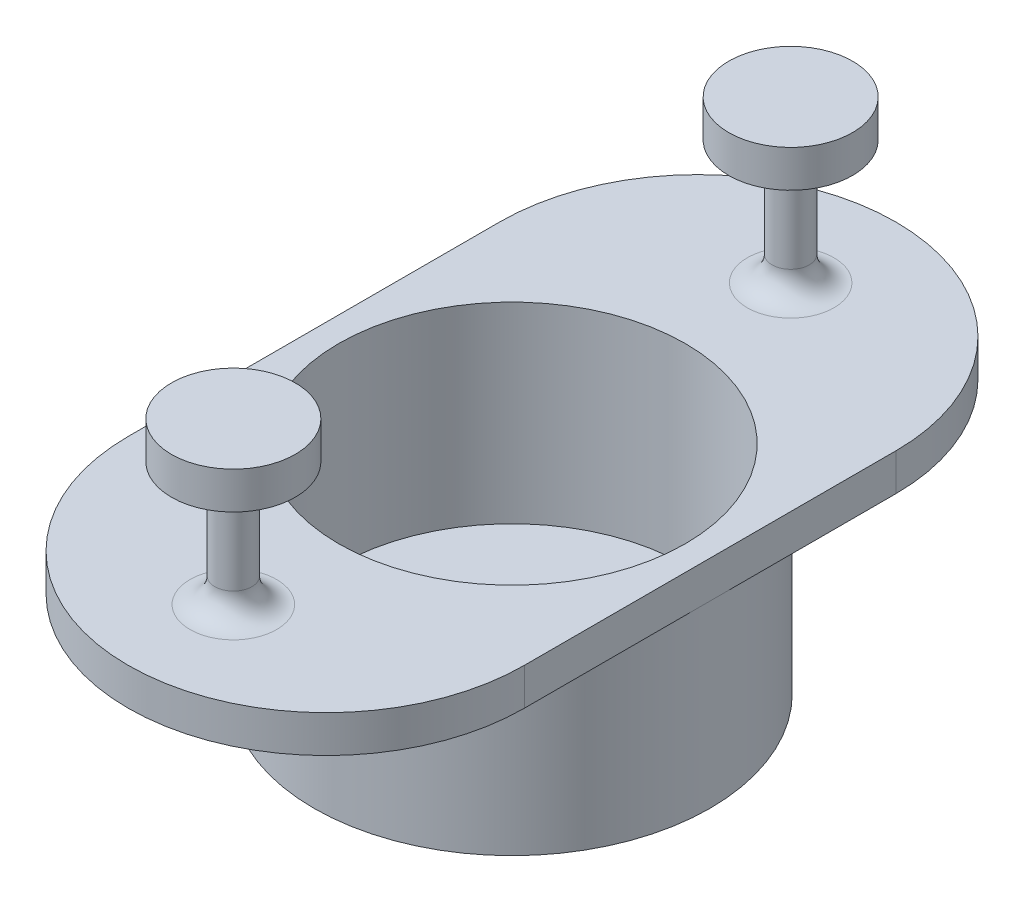
ISO-10303-21;
HEADER;
FILE_DESCRIPTION(('STEP AP214'),'2;1');
FILE_NAME('part.step','',(''),(''),'','','');
FILE_SCHEMA(('AUTOMOTIVE_DESIGN { 1 0 10303 214 1 1 1 1 }'));
ENDSEC;
DATA;
#1=APPLICATION_CONTEXT('core data for automotive mechanical design processes');
#2=APPLICATION_PROTOCOL_DEFINITION('international standard','automotive_design',2000,#1);
#3=PRODUCT_CONTEXT('',#1,'mechanical');
#4=PRODUCT('Part','Part','',(#3));
#5=PRODUCT_RELATED_PRODUCT_CATEGORY('part','',(#4));
#6=PRODUCT_DEFINITION_FORMATION('','',#4);
#7=PRODUCT_DEFINITION_CONTEXT('part definition',#1,'design');
#8=PRODUCT_DEFINITION('design','',#6,#7);
#9=PRODUCT_DEFINITION_SHAPE('','',#8);
#10=(LENGTH_UNIT() NAMED_UNIT(*) SI_UNIT(.MILLI.,.METRE.));
#11=(NAMED_UNIT(*) PLANE_ANGLE_UNIT() SI_UNIT($,.RADIAN.));
#12=(NAMED_UNIT(*) SI_UNIT($,.STERADIAN.) SOLID_ANGLE_UNIT());
#13=UNCERTAINTY_MEASURE_WITH_UNIT(LENGTH_MEASURE(1.E-05),#10,'distance_accuracy_value','');
#14=(GEOMETRIC_REPRESENTATION_CONTEXT(3) GLOBAL_UNCERTAINTY_ASSIGNED_CONTEXT((#13)) GLOBAL_UNIT_ASSIGNED_CONTEXT((#10,
#11,#12)) REPRESENTATION_CONTEXT('',''));
#15=CARTESIAN_POINT('',(0.,0.,0.));
#16=DIRECTION('',(0.,0.,1.));
#17=DIRECTION('',(1.,0.,0.));
#18=AXIS2_PLACEMENT_3D('',#15,#16,#17);
#19=CARTESIAN_POINT('',(0.,14.5,0.));
#20=DIRECTION('',(0.,-1.,0.));
#21=DIRECTION('',(0.,0.,-1.));
#22=AXIS2_PLACEMENT_3D('',#19,#20,#21);
#23=CYLINDRICAL_SURFACE('',#22,16.);
#24=CARTESIAN_POINT('',(0.,14.5,0.));
#25=DIRECTION('',(0.,1.,0.));
#26=DIRECTION('',(0.,0.,1.));
#27=AXIS2_PLACEMENT_3D('',#24,#25,#26);
#28=CIRCLE('',#27,16.);
#29=CARTESIAN_POINT('',(16.,14.5,0.));
#30=VERTEX_POINT('',#29);
#31=CARTESIAN_POINT('',(-16.,14.5,0.));
#32=VERTEX_POINT('',#31);
#33=EDGE_CURVE('E58',#30,#32,#28,.T.);
#34=ORIENTED_EDGE('',*,*,#33,.F.);
#35=EDGE_CURVE('E55',#32,#30,#28,.T.);
#36=ORIENTED_EDGE('',*,*,#35,.F.);
#37=EDGE_LOOP('',(#34,#36));
#38=FACE_BOUND('',#37,.T.);
#39=CARTESIAN_POINT('',(0.,0.,0.));
#40=DIRECTION('',(0.,1.,0.));
#41=DIRECTION('',(0.,0.,1.));
#42=AXIS2_PLACEMENT_3D('',#39,#40,#41);
#43=CIRCLE('',#42,16.);
#44=CARTESIAN_POINT('',(0.,0.,16.));
#45=VERTEX_POINT('',#44);
#46=EDGE_CURVE('E111',#45,#45,#43,.T.);
#47=ORIENTED_EDGE('',*,*,#46,.T.);
#48=EDGE_LOOP('',(#47));
#49=FACE_BOUND('',#48,.T.);
#50=ADVANCED_FACE('F41',(#38,#49),#23,.T.);
#51=CARTESIAN_POINT('',(0.,0.,0.));
#52=DIRECTION('',(0.,1.,0.));
#53=DIRECTION('',(0.,0.,1.));
#54=AXIS2_PLACEMENT_3D('',#51,#52,#53);
#55=PLANE('',#54);
#56=CARTESIAN_POINT('',(7.5,0.,0.));
#57=DIRECTION('',(0.,1.,0.));
#58=DIRECTION('',(0.,0.,1.));
#59=AXIS2_PLACEMENT_3D('',#56,#57,#58);
#60=CIRCLE('',#59,1.5);
#61=CARTESIAN_POINT('',(7.5,0.,1.5));
#62=VERTEX_POINT('',#61);
#63=EDGE_CURVE('E452',#62,#62,#60,.T.);
#64=ORIENTED_EDGE('',*,*,#63,.T.);
#65=EDGE_LOOP('',(#64));
#66=FACE_BOUND('',#65,.T.);
#67=CARTESIAN_POINT('',(-7.5,0.,-1.57459931571508E-13));
#68=DIRECTION('',(0.,1.,0.));
#69=DIRECTION('',(0.,0.,1.));
#70=AXIS2_PLACEMENT_3D('',#67,#68,#69);
#71=CIRCLE('',#70,1.5);
#72=CARTESIAN_POINT('',(-7.5,0.,1.49999999999984));
#73=VERTEX_POINT('',#72);
#74=EDGE_CURVE('E456',#73,#73,#71,.T.);
#75=ORIENTED_EDGE('',*,*,#74,.T.);
#76=EDGE_LOOP('',(#75));
#77=FACE_BOUND('',#76,.T.);
#78=ORIENTED_EDGE('',*,*,#46,.F.);
#79=EDGE_LOOP('',(#78));
#80=FACE_BOUND('',#79,.T.);
#81=ADVANCED_FACE('F163',(#66,#77,#80),#55,.F.);
#82=CARTESIAN_POINT('',(0.,14.5,15.));
#83=DIRECTION('',(0.,1.,0.));
#84=DIRECTION('',(0.,0.,1.));
#85=AXIS2_PLACEMENT_3D('',#82,#83,#84);
#86=PLANE('',#85);
#87=DIRECTION('',(0.,0.,-1.));
#88=VECTOR('',#87,1.);
#89=CARTESIAN_POINT('',(16.,14.5,15.));
#90=LINE('',#89,#88);
#91=CARTESIAN_POINT('',(16.,14.5,-15.));
#92=VERTEX_POINT('',#91);
#93=EDGE_CURVE('E428',#30,#92,#90,.T.);
#94=ORIENTED_EDGE('',*,*,#93,.F.);
#95=ORIENTED_EDGE('',*,*,#33,.T.);
#96=DIRECTION('',(0.,0.,1.));
#97=VECTOR('',#96,1.);
#98=CARTESIAN_POINT('',(-16.,14.5,15.));
#99=LINE('',#98,#97);
#100=CARTESIAN_POINT('',(-16.,14.5,-15.));
#101=VERTEX_POINT('',#100);
#102=EDGE_CURVE('E106',#101,#32,#99,.T.);
#103=ORIENTED_EDGE('',*,*,#102,.F.);
#104=CARTESIAN_POINT('',(0.,14.5,-15.));
#105=DIRECTION('',(0.,1.,0.));
#106=DIRECTION('',(0.,0.,1.));
#107=AXIS2_PLACEMENT_3D('',#104,#105,#106);
#108=CIRCLE('',#107,16.);
#109=EDGE_CURVE('E431',#92,#101,#108,.T.);
#110=ORIENTED_EDGE('',*,*,#109,.F.);
#111=EDGE_LOOP('',(#94,#95,#103,#110));
#112=FACE_BOUND('',#111,.T.);
#113=ADVANCED_FACE('F168',(#112),#86,.F.);
#114=CARTESIAN_POINT('',(-16.,14.5,15.));
#115=VERTEX_POINT('',#114);
#116=EDGE_CURVE('E434',#32,#115,#99,.T.);
#117=ORIENTED_EDGE('',*,*,#116,.F.);
#118=ORIENTED_EDGE('',*,*,#35,.T.);
#119=CARTESIAN_POINT('',(16.,14.5,15.));
#120=VERTEX_POINT('',#119);
#121=EDGE_CURVE('E432',#120,#30,#90,.T.);
#122=ORIENTED_EDGE('',*,*,#121,.F.);
#123=CARTESIAN_POINT('',(0.,14.5,15.));
#124=DIRECTION('',(0.,1.,0.));
#125=DIRECTION('',(0.,0.,1.));
#126=AXIS2_PLACEMENT_3D('',#123,#124,#125);
#127=CIRCLE('',#126,16.);
#128=EDGE_CURVE('E110',#115,#120,#127,.T.);
#129=ORIENTED_EDGE('',*,*,#128,.F.);
#130=EDGE_LOOP('',(#117,#118,#122,#129));
#131=FACE_BOUND('',#130,.T.);
#132=ADVANCED_FACE('F385',(#131),#86,.F.);
#133=CARTESIAN_POINT('',(0.,17.5,15.));
#134=DIRECTION('',(0.,-1.,0.));
#135=DIRECTION('',(0.,0.,-1.));
#136=AXIS2_PLACEMENT_3D('',#133,#134,#135);
#137=CYLINDRICAL_SURFACE('',#136,16.);
#138=ORIENTED_EDGE('',*,*,#128,.T.);
#139=DIRECTION('',(0.,-1.,0.));
#140=VECTOR('',#139,1.);
#141=CARTESIAN_POINT('',(16.,17.5,15.));
#142=LINE('',#141,#140);
#143=CARTESIAN_POINT('',(16.,17.5,15.));
#144=VERTEX_POINT('',#143);
#145=EDGE_CURVE('E90',#144,#120,#142,.T.);
#146=ORIENTED_EDGE('',*,*,#145,.F.);
#147=CARTESIAN_POINT('',(0.,17.5,15.));
#148=DIRECTION('',(0.,1.,0.));
#149=DIRECTION('',(0.,0.,1.));
#150=AXIS2_PLACEMENT_3D('',#147,#148,#149);
#151=CIRCLE('',#150,16.);
#152=CARTESIAN_POINT('',(-16.,17.5,15.));
#153=VERTEX_POINT('',#152);
#154=EDGE_CURVE('E97',#153,#144,#151,.T.);
#155=ORIENTED_EDGE('',*,*,#154,.F.);
#156=DIRECTION('',(0.,-1.,0.));
#157=VECTOR('',#156,1.);
#158=CARTESIAN_POINT('',(-16.,17.5,15.));
#159=LINE('',#158,#157);
#160=EDGE_CURVE('E441',#153,#115,#159,.T.);
#161=ORIENTED_EDGE('',*,*,#160,.T.);
#162=EDGE_LOOP('',(#138,#146,#155,#161));
#163=FACE_BOUND('',#162,.T.);
#164=ADVANCED_FACE('F108',(#163),#137,.T.);
#165=CARTESIAN_POINT('',(16.,17.5,15.));
#166=DIRECTION('',(-1.,0.,0.));
#167=DIRECTION('',(0.,0.,1.));
#168=AXIS2_PLACEMENT_3D('',#165,#166,#167);
#169=PLANE('',#168);
#170=ORIENTED_EDGE('',*,*,#121,.T.);
#171=ORIENTED_EDGE('',*,*,#93,.T.);
#172=DIRECTION('',(0.,-1.,0.));
#173=VECTOR('',#172,1.);
#174=CARTESIAN_POINT('',(16.,17.5,-15.));
#175=LINE('',#174,#173);
#176=CARTESIAN_POINT('',(16.,17.5,-15.));
#177=VERTEX_POINT('',#176);
#178=EDGE_CURVE('E93',#177,#92,#175,.T.);
#179=ORIENTED_EDGE('',*,*,#178,.F.);
#180=DIRECTION('',(0.,0.,-1.));
#181=VECTOR('',#180,1.);
#182=CARTESIAN_POINT('',(16.,17.5,15.));
#183=LINE('',#182,#181);
#184=EDGE_CURVE('E85',#144,#177,#183,.T.);
#185=ORIENTED_EDGE('',*,*,#184,.F.);
#186=ORIENTED_EDGE('',*,*,#145,.T.);
#187=EDGE_LOOP('',(#170,#171,#179,#185,#186));
#188=FACE_BOUND('',#187,.T.);
#189=ADVANCED_FACE('F88',(#188),#169,.F.);
#190=CARTESIAN_POINT('',(0.,17.5,-15.));
#191=DIRECTION('',(0.,-1.,0.));
#192=DIRECTION('',(0.,0.,-1.));
#193=AXIS2_PLACEMENT_3D('',#190,#191,#192);
#194=CYLINDRICAL_SURFACE('',#193,16.);
#195=ORIENTED_EDGE('',*,*,#109,.T.);
#196=DIRECTION('',(0.,-1.,0.));
#197=VECTOR('',#196,1.);
#198=CARTESIAN_POINT('',(-16.,17.5,-15.));
#199=LINE('',#198,#197);
#200=CARTESIAN_POINT('',(-16.,17.5,-15.));
#201=VERTEX_POINT('',#200);
#202=EDGE_CURVE('E115',#201,#101,#199,.T.);
#203=ORIENTED_EDGE('',*,*,#202,.F.);
#204=CARTESIAN_POINT('',(0.,17.5,-15.));
#205=DIRECTION('',(0.,1.,0.));
#206=DIRECTION('',(0.,0.,1.));
#207=AXIS2_PLACEMENT_3D('',#204,#205,#206);
#208=CIRCLE('',#207,16.);
#209=EDGE_CURVE('E96',#177,#201,#208,.T.);
#210=ORIENTED_EDGE('',*,*,#209,.F.);
#211=ORIENTED_EDGE('',*,*,#178,.T.);
#212=EDGE_LOOP('',(#195,#203,#210,#211));
#213=FACE_BOUND('',#212,.T.);
#214=ADVANCED_FACE('F355',(#213),#194,.T.);
#215=CARTESIAN_POINT('',(-16.,17.5,15.));
#216=DIRECTION('',(1.,0.,0.));
#217=DIRECTION('',(0.,0.,-1.));
#218=AXIS2_PLACEMENT_3D('',#215,#216,#217);
#219=PLANE('',#218);
#220=ORIENTED_EDGE('',*,*,#102,.T.);
#221=ORIENTED_EDGE('',*,*,#116,.T.);
#222=ORIENTED_EDGE('',*,*,#160,.F.);
#223=DIRECTION('',(0.,0.,1.));
#224=VECTOR('',#223,1.);
#225=CARTESIAN_POINT('',(-16.,17.5,15.));
#226=LINE('',#225,#224);
#227=EDGE_CURVE('E102',#201,#153,#226,.T.);
#228=ORIENTED_EDGE('',*,*,#227,.F.);
#229=ORIENTED_EDGE('',*,*,#202,.T.);
#230=EDGE_LOOP('',(#220,#221,#222,#228,#229));
#231=FACE_BOUND('',#230,.T.);
#232=ADVANCED_FACE('F159',(#231),#219,.F.);
#233=CARTESIAN_POINT('',(0.,17.5,15.));
#234=DIRECTION('',(0.,1.,0.));
#235=DIRECTION('',(0.,0.,1.));
#236=AXIS2_PLACEMENT_3D('',#233,#234,#235);
#237=PLANE('',#236);
#238=CARTESIAN_POINT('',(0.,17.5,22.5));
#239=DIRECTION('',(0.,1.,0.));
#240=DIRECTION('',(0.,0.,1.));
#241=AXIS2_PLACEMENT_3D('',#238,#239,#240);
#242=CIRCLE('',#241,3.5);
#243=CARTESIAN_POINT('',(0.,17.5,26.));
#244=VERTEX_POINT('',#243);
#245=EDGE_CURVE('E12',#244,#244,#242,.F.);
#246=ORIENTED_EDGE('',*,*,#245,.T.);
#247=EDGE_LOOP('',(#246));
#248=FACE_BOUND('',#247,.T.);
#249=CARTESIAN_POINT('',(0.,17.5,-22.5));
#250=DIRECTION('',(0.,1.,0.));
#251=DIRECTION('',(0.,0.,1.));
#252=AXIS2_PLACEMENT_3D('',#249,#250,#251);
#253=CIRCLE('',#252,3.50000000000001);
#254=CARTESIAN_POINT('',(0.,17.5,-19.));
#255=VERTEX_POINT('',#254);
#256=EDGE_CURVE('E49',#255,#255,#253,.F.);
#257=ORIENTED_EDGE('',*,*,#256,.T.);
#258=EDGE_LOOP('',(#257));
#259=FACE_BOUND('',#258,.T.);
#260=CARTESIAN_POINT('',(0.,17.5,0.));
#261=DIRECTION('',(0.,1.,0.));
#262=DIRECTION('',(0.,0.,1.));
#263=AXIS2_PLACEMENT_3D('',#260,#261,#262);
#264=CIRCLE('',#263,14.);
#265=CARTESIAN_POINT('',(0.,17.5,14.));
#266=VERTEX_POINT('',#265);
#267=EDGE_CURVE('E449',#266,#266,#264,.T.);
#268=ORIENTED_EDGE('',*,*,#267,.F.);
#269=EDGE_LOOP('',(#268));
#270=FACE_BOUND('',#269,.T.);
#271=ORIENTED_EDGE('',*,*,#154,.T.);
#272=ORIENTED_EDGE('',*,*,#184,.T.);
#273=ORIENTED_EDGE('',*,*,#209,.T.);
#274=ORIENTED_EDGE('',*,*,#227,.T.);
#275=EDGE_LOOP('',(#271,#272,#273,#274));
#276=FACE_BOUND('',#275,.T.);
#277=ADVANCED_FACE('F100',(#248,#259,#270,#276),#237,.T.);
#278=CARTESIAN_POINT('',(0.,27.5,-22.5));
#279=DIRECTION('',(0.,-1.,0.));
#280=DIRECTION('',(0.,0.,-1.));
#281=AXIS2_PLACEMENT_3D('',#278,#279,#280);
#282=CYLINDRICAL_SURFACE('',#281,1.50000000000001);
#283=CARTESIAN_POINT('',(0.,25.5,-22.5));
#284=DIRECTION('',(0.,1.,0.));
#285=DIRECTION('',(0.,0.,1.));
#286=AXIS2_PLACEMENT_3D('',#283,#284,#285);
#287=CIRCLE('',#286,1.50000000000001);
#288=CARTESIAN_POINT('',(0.,25.5,-21.));
#289=VERTEX_POINT('',#288);
#290=EDGE_CURVE('E126',#289,#289,#287,.F.);
#291=ORIENTED_EDGE('',*,*,#290,.T.);
#292=EDGE_LOOP('',(#291));
#293=FACE_BOUND('',#292,.T.);
#294=CARTESIAN_POINT('',(0.,19.5,-22.5));
#295=DIRECTION('',(0.,1.,0.));
#296=DIRECTION('',(0.,0.,1.));
#297=AXIS2_PLACEMENT_3D('',#294,#295,#296);
#298=CIRCLE('',#297,1.50000000000001);
#299=CARTESIAN_POINT('',(0.,19.5,-21.));
#300=VERTEX_POINT('',#299);
#301=EDGE_CURVE('E123',#300,#300,#298,.T.);
#302=ORIENTED_EDGE('',*,*,#301,.T.);
#303=EDGE_LOOP('',(#302));
#304=FACE_BOUND('',#303,.T.);
#305=ADVANCED_FACE('F147',(#293,#304),#282,.T.);
#306=CARTESIAN_POINT('',(0.,27.5,22.5));
#307=DIRECTION('',(0.,-1.,0.));
#308=DIRECTION('',(0.,0.,-1.));
#309=AXIS2_PLACEMENT_3D('',#306,#307,#308);
#310=CYLINDRICAL_SURFACE('',#309,1.5);
#311=CARTESIAN_POINT('',(0.,25.5,22.5));
#312=DIRECTION('',(0.,1.,0.));
#313=DIRECTION('',(0.,0.,1.));
#314=AXIS2_PLACEMENT_3D('',#311,#312,#313);
#315=CIRCLE('',#314,1.5);
#316=CARTESIAN_POINT('',(0.,25.5,24.));
#317=VERTEX_POINT('',#316);
#318=EDGE_CURVE('E135',#317,#317,#315,.F.);
#319=ORIENTED_EDGE('',*,*,#318,.T.);
#320=EDGE_LOOP('',(#319));
#321=FACE_BOUND('',#320,.T.);
#322=CARTESIAN_POINT('',(0.,19.5,22.5));
#323=DIRECTION('',(0.,1.,0.));
#324=DIRECTION('',(0.,0.,1.));
#325=AXIS2_PLACEMENT_3D('',#322,#323,#324);
#326=CIRCLE('',#325,1.5);
#327=CARTESIAN_POINT('',(0.,19.5,24.));
#328=VERTEX_POINT('',#327);
#329=EDGE_CURVE('E132',#328,#328,#326,.T.);
#330=ORIENTED_EDGE('',*,*,#329,.T.);
#331=EDGE_LOOP('',(#330));
#332=FACE_BOUND('',#331,.T.);
#333=ADVANCED_FACE('F149',(#321,#332),#310,.T.);
#334=CARTESIAN_POINT('',(0.,-39.5979797464467,0.));
#335=DIRECTION('',(0.,1.,0.));
#336=DIRECTION('',(0.,0.,1.));
#337=AXIS2_PLACEMENT_3D('',#334,#335,#336);
#338=CYLINDRICAL_SURFACE('',#337,14.);
#339=CARTESIAN_POINT('',(0.,2.,0.));
#340=DIRECTION('',(0.,1.,0.));
#341=DIRECTION('',(0.,0.,1.));
#342=AXIS2_PLACEMENT_3D('',#339,#340,#341);
#343=CIRCLE('',#342,14.);
#344=CARTESIAN_POINT('',(0.,2.,14.));
#345=VERTEX_POINT('',#344);
#346=EDGE_CURVE('E446',#345,#345,#343,.F.);
#347=ORIENTED_EDGE('',*,*,#346,.T.);
#348=EDGE_LOOP('',(#347));
#349=FACE_BOUND('',#348,.T.);
#350=ORIENTED_EDGE('',*,*,#267,.T.);
#351=EDGE_LOOP('',(#350));
#352=FACE_BOUND('',#351,.T.);
#353=ADVANCED_FACE('F156',(#349,#352),#338,.F.);
#354=CARTESIAN_POINT('',(0.,2.,0.));
#355=DIRECTION('',(0.,1.,0.));
#356=DIRECTION('',(0.,0.,1.));
#357=AXIS2_PLACEMENT_3D('',#354,#355,#356);
#358=PLANE('',#357);
#359=CARTESIAN_POINT('',(7.5,2.,0.));
#360=DIRECTION('',(0.,1.,0.));
#361=DIRECTION('',(0.,0.,1.));
#362=AXIS2_PLACEMENT_3D('',#359,#360,#361);
#363=CIRCLE('',#362,1.5);
#364=CARTESIAN_POINT('',(7.5,2.,1.5));
#365=VERTEX_POINT('',#364);
#366=EDGE_CURVE('E460',#365,#365,#363,.T.);
#367=ORIENTED_EDGE('',*,*,#366,.F.);
#368=EDGE_LOOP('',(#367));
#369=FACE_BOUND('',#368,.T.);
#370=CARTESIAN_POINT('',(-7.5,2.,-1.57459931571508E-13));
#371=DIRECTION('',(0.,1.,0.));
#372=DIRECTION('',(0.,0.,1.));
#373=AXIS2_PLACEMENT_3D('',#370,#371,#372);
#374=CIRCLE('',#373,1.5);
#375=CARTESIAN_POINT('',(-7.5,2.,1.49999999999984));
#376=VERTEX_POINT('',#375);
#377=EDGE_CURVE('E453',#376,#376,#374,.T.);
#378=ORIENTED_EDGE('',*,*,#377,.F.);
#379=EDGE_LOOP('',(#378));
#380=FACE_BOUND('',#379,.T.);
#381=ORIENTED_EDGE('',*,*,#346,.F.);
#382=EDGE_LOOP('',(#381));
#383=FACE_BOUND('',#382,.T.);
#384=ADVANCED_FACE('F305',(#369,#380,#383),#358,.T.);
#385=CARTESIAN_POINT('',(-7.5,0.,-1.57459931571508E-13));
#386=DIRECTION('',(0.,1.,0.));
#387=DIRECTION('',(0.,0.,1.));
#388=AXIS2_PLACEMENT_3D('',#385,#386,#387);
#389=CYLINDRICAL_SURFACE('',#388,1.5);
#390=ORIENTED_EDGE('',*,*,#74,.F.);
#391=EDGE_LOOP('',(#390));
#392=FACE_BOUND('',#391,.T.);
#393=ORIENTED_EDGE('',*,*,#377,.T.);
#394=EDGE_LOOP('',(#393));
#395=FACE_BOUND('',#394,.T.);
#396=ADVANCED_FACE('F294',(#392,#395),#389,.F.);
#397=CARTESIAN_POINT('',(7.5,0.,0.));
#398=DIRECTION('',(0.,1.,0.));
#399=DIRECTION('',(0.,0.,1.));
#400=AXIS2_PLACEMENT_3D('',#397,#398,#399);
#401=CYLINDRICAL_SURFACE('',#400,1.5);
#402=ORIENTED_EDGE('',*,*,#63,.F.);
#403=EDGE_LOOP('',(#402));
#404=FACE_BOUND('',#403,.T.);
#405=ORIENTED_EDGE('',*,*,#366,.T.);
#406=EDGE_LOOP('',(#405));
#407=FACE_BOUND('',#406,.T.);
#408=ADVANCED_FACE('F283',(#404,#407),#401,.F.);
#409=CARTESIAN_POINT('',(0.,30.5,-22.5));
#410=DIRECTION('',(0.,-1.,0.));
#411=DIRECTION('',(0.,0.,-1.));
#412=AXIS2_PLACEMENT_3D('',#409,#410,#411);
#413=CYLINDRICAL_SURFACE('',#412,5.);
#414=CARTESIAN_POINT('',(0.,30.5,-22.5));
#415=DIRECTION('',(0.,1.,0.));
#416=DIRECTION('',(0.,0.,1.));
#417=AXIS2_PLACEMENT_3D('',#414,#415,#416);
#418=CIRCLE('',#417,5.);
#419=CARTESIAN_POINT('',(0.,30.5,-17.5));
#420=VERTEX_POINT('',#419);
#421=EDGE_CURVE('E457',#420,#420,#418,.T.);
#422=ORIENTED_EDGE('',*,*,#421,.F.);
#423=EDGE_LOOP('',(#422));
#424=FACE_BOUND('',#423,.T.);
#425=CARTESIAN_POINT('',(0.,27.5,-22.5));
#426=DIRECTION('',(0.,1.,0.));
#427=DIRECTION('',(0.,0.,1.));
#428=AXIS2_PLACEMENT_3D('',#425,#426,#427);
#429=CIRCLE('',#428,5.);
#430=CARTESIAN_POINT('',(0.,27.5,-17.5));
#431=VERTEX_POINT('',#430);
#432=EDGE_CURVE('E465',#431,#431,#429,.T.);
#433=ORIENTED_EDGE('',*,*,#432,.T.);
#434=EDGE_LOOP('',(#433));
#435=FACE_BOUND('',#434,.T.);
#436=ADVANCED_FACE('F272',(#424,#435),#413,.T.);
#437=CARTESIAN_POINT('',(0.,30.5,-22.5));
#438=DIRECTION('',(0.,1.,0.));
#439=DIRECTION('',(0.,0.,1.));
#440=AXIS2_PLACEMENT_3D('',#437,#438,#439);
#441=PLANE('',#440);
#442=ORIENTED_EDGE('',*,*,#421,.T.);
#443=EDGE_LOOP('',(#442));
#444=FACE_BOUND('',#443,.T.);
#445=ADVANCED_FACE('F261',(#444),#441,.T.);
#446=CARTESIAN_POINT('',(0.,27.5,-22.5));
#447=DIRECTION('',(0.,1.,0.));
#448=DIRECTION('',(0.,0.,1.));
#449=AXIS2_PLACEMENT_3D('',#446,#447,#448);
#450=PLANE('',#449);
#451=CARTESIAN_POINT('',(0.,27.5,-22.5));
#452=DIRECTION('',(0.,1.,0.));
#453=DIRECTION('',(0.,0.,1.));
#454=AXIS2_PLACEMENT_3D('',#451,#452,#453);
#455=CIRCLE('',#454,3.50000000000001);
#456=CARTESIAN_POINT('',(0.,27.5,-19.));
#457=VERTEX_POINT('',#456);
#458=EDGE_CURVE('E119',#457,#457,#455,.T.);
#459=ORIENTED_EDGE('',*,*,#458,.T.);
#460=EDGE_LOOP('',(#459));
#461=FACE_BOUND('',#460,.T.);
#462=ORIENTED_EDGE('',*,*,#432,.F.);
#463=EDGE_LOOP('',(#462));
#464=FACE_BOUND('',#463,.T.);
#465=ADVANCED_FACE('F250',(#461,#464),#450,.F.);
#466=CARTESIAN_POINT('',(0.,30.5,22.5));
#467=DIRECTION('',(0.,-1.,0.));
#468=DIRECTION('',(0.,0.,-1.));
#469=AXIS2_PLACEMENT_3D('',#466,#467,#468);
#470=CYLINDRICAL_SURFACE('',#469,5.);
#471=CARTESIAN_POINT('',(0.,30.5,22.5));
#472=DIRECTION('',(0.,1.,0.));
#473=DIRECTION('',(0.,0.,1.));
#474=AXIS2_PLACEMENT_3D('',#471,#472,#473);
#475=CIRCLE('',#474,5.);
#476=CARTESIAN_POINT('',(0.,30.5,27.5));
#477=VERTEX_POINT('',#476);
#478=EDGE_CURVE('E471',#477,#477,#475,.T.);
#479=ORIENTED_EDGE('',*,*,#478,.F.);
#480=EDGE_LOOP('',(#479));
#481=FACE_BOUND('',#480,.T.);
#482=CARTESIAN_POINT('',(0.,27.5,22.5));
#483=DIRECTION('',(0.,1.,0.));
#484=DIRECTION('',(0.,0.,1.));
#485=AXIS2_PLACEMENT_3D('',#482,#483,#484);
#486=CIRCLE('',#485,5.);
#487=CARTESIAN_POINT('',(0.,27.5,27.5));
#488=VERTEX_POINT('',#487);
#489=EDGE_CURVE('E468',#488,#488,#486,.T.);
#490=ORIENTED_EDGE('',*,*,#489,.T.);
#491=EDGE_LOOP('',(#490));
#492=FACE_BOUND('',#491,.T.);
#493=ADVANCED_FACE('F238',(#481,#492),#470,.T.);
#494=CARTESIAN_POINT('',(0.,30.5,22.5));
#495=DIRECTION('',(0.,1.,0.));
#496=DIRECTION('',(0.,0.,1.));
#497=AXIS2_PLACEMENT_3D('',#494,#495,#496);
#498=PLANE('',#497);
#499=ORIENTED_EDGE('',*,*,#478,.T.);
#500=EDGE_LOOP('',(#499));
#501=FACE_BOUND('',#500,.T.);
#502=ADVANCED_FACE('F226',(#501),#498,.T.);
#503=CARTESIAN_POINT('',(0.,27.5,22.5));
#504=DIRECTION('',(0.,1.,0.));
#505=DIRECTION('',(0.,0.,1.));
#506=AXIS2_PLACEMENT_3D('',#503,#504,#505);
#507=PLANE('',#506);
#508=CARTESIAN_POINT('',(0.,27.5,22.5));
#509=DIRECTION('',(0.,1.,0.));
#510=DIRECTION('',(0.,0.,1.));
#511=AXIS2_PLACEMENT_3D('',#508,#509,#510);
#512=CIRCLE('',#511,3.5);
#513=CARTESIAN_POINT('',(0.,27.5,26.));
#514=VERTEX_POINT('',#513);
#515=EDGE_CURVE('E129',#514,#514,#512,.T.);
#516=ORIENTED_EDGE('',*,*,#515,.T.);
#517=EDGE_LOOP('',(#516));
#518=FACE_BOUND('',#517,.T.);
#519=ORIENTED_EDGE('',*,*,#489,.F.);
#520=EDGE_LOOP('',(#519));
#521=FACE_BOUND('',#520,.T.);
#522=ADVANCED_FACE('F178',(#518,#521),#507,.F.);
#523=CARTESIAN_POINT('',(0.,25.5,-22.5));
#524=DIRECTION('',(0.,1.,0.));
#525=DIRECTION('',(0.,0.,1.));
#526=AXIS2_PLACEMENT_3D('',#523,#524,#525);
#527=TOROIDAL_SURFACE('',#526,3.50000000000001,2.);
#528=ORIENTED_EDGE('',*,*,#290,.F.);
#529=EDGE_LOOP('',(#528));
#530=FACE_BOUND('',#529,.T.);
#531=ORIENTED_EDGE('',*,*,#458,.F.);
#532=EDGE_LOOP('',(#531));
#533=FACE_BOUND('',#532,.T.);
#534=ADVANCED_FACE('F174',(#530,#533),#527,.F.);
#535=CARTESIAN_POINT('',(0.,25.5,22.5));
#536=DIRECTION('',(0.,1.,0.));
#537=DIRECTION('',(0.,0.,1.));
#538=AXIS2_PLACEMENT_3D('',#535,#536,#537);
#539=TOROIDAL_SURFACE('',#538,3.5,2.);
#540=ORIENTED_EDGE('',*,*,#318,.F.);
#541=EDGE_LOOP('',(#540));
#542=FACE_BOUND('',#541,.T.);
#543=ORIENTED_EDGE('',*,*,#515,.F.);
#544=EDGE_LOOP('',(#543));
#545=FACE_BOUND('',#544,.T.);
#546=ADVANCED_FACE('F177',(#542,#545),#539,.F.);
#547=CARTESIAN_POINT('',(0.,19.5,22.5));
#548=DIRECTION('',(0.,1.,0.));
#549=DIRECTION('',(0.,0.,1.));
#550=AXIS2_PLACEMENT_3D('',#547,#548,#549);
#551=TOROIDAL_SURFACE('',#550,3.5,2.);
#552=ORIENTED_EDGE('',*,*,#245,.F.);
#553=EDGE_LOOP('',(#552));
#554=FACE_BOUND('',#553,.T.);
#555=ORIENTED_EDGE('',*,*,#329,.F.);
#556=EDGE_LOOP('',(#555));
#557=FACE_BOUND('',#556,.T.);
#558=ADVANCED_FACE('F144',(#554,#557),#551,.F.);
#559=CARTESIAN_POINT('',(0.,19.5,-22.5));
#560=DIRECTION('',(0.,1.,0.));
#561=DIRECTION('',(0.,0.,1.));
#562=AXIS2_PLACEMENT_3D('',#559,#560,#561);
#563=TOROIDAL_SURFACE('',#562,3.50000000000001,2.);
#564=ORIENTED_EDGE('',*,*,#256,.F.);
#565=EDGE_LOOP('',(#564));
#566=FACE_BOUND('',#565,.T.);
#567=ORIENTED_EDGE('',*,*,#301,.F.);
#568=EDGE_LOOP('',(#567));
#569=FACE_BOUND('',#568,.T.);
#570=ADVANCED_FACE('F43',(#566,#569),#563,.F.);
#571=CLOSED_SHELL('',(#50,#81,#113,#132,#164,#189,#214,#232,#277,#305,#333,#353,#384,#396,#408,
#436,#445,#465,#493,#502,#522,#534,#546,#558,#570));
#572=MANIFOLD_SOLID_BREP('B2',#571);
#573=ADVANCED_BREP_SHAPE_REPRESENTATION('',(#18,#572),#14);
#574=SHAPE_DEFINITION_REPRESENTATION(#9,#573);
ENDSEC;
END-ISO-10303-21;
